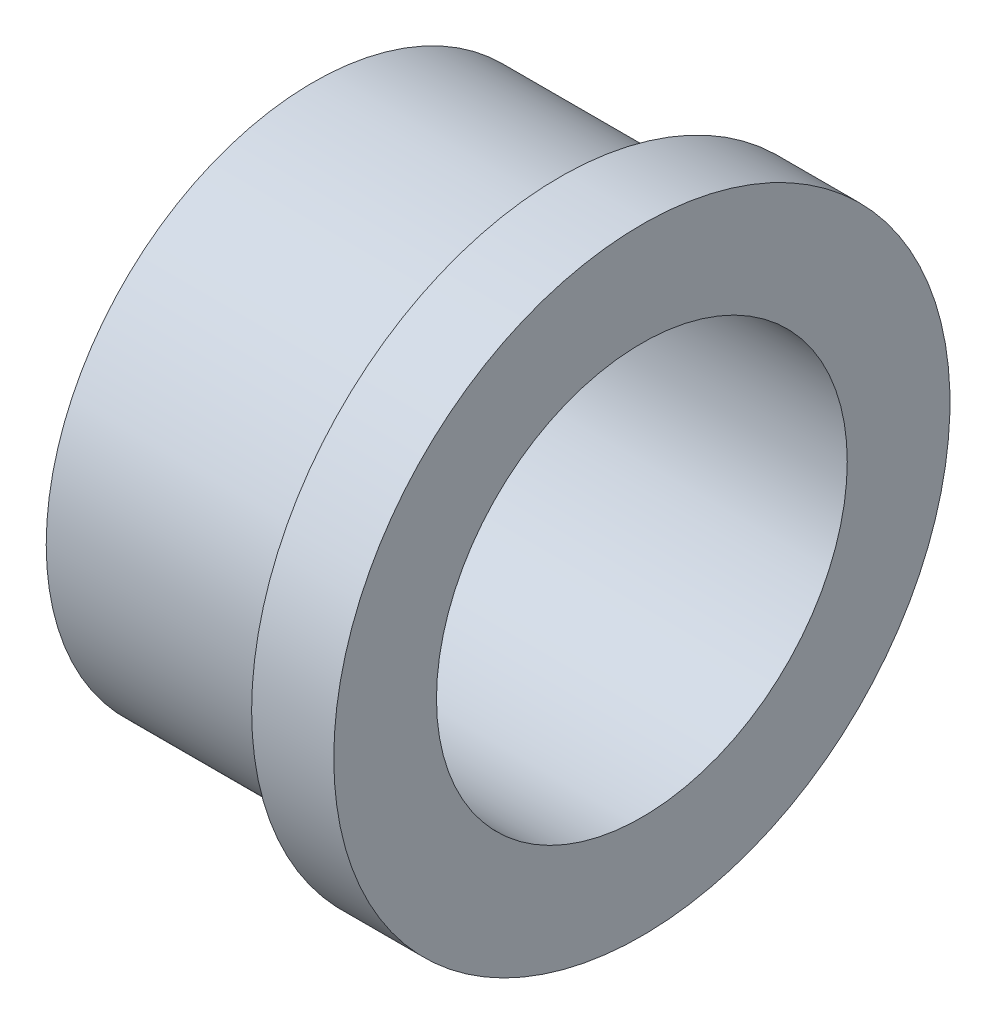
ISO-10303-21;
HEADER;
FILE_DESCRIPTION(('STEP AP214'),'2;1');
FILE_NAME('part.step','',(''),(''),'','','');
FILE_SCHEMA(('AUTOMOTIVE_DESIGN { 1 0 10303 214 1 1 1 1 }'));
ENDSEC;
DATA;
#1=APPLICATION_CONTEXT('core data for automotive mechanical design processes');
#2=APPLICATION_PROTOCOL_DEFINITION('international standard','automotive_design',2000,#1);
#3=PRODUCT_CONTEXT('',#1,'mechanical');
#4=PRODUCT('Part','Part','',(#3));
#5=PRODUCT_RELATED_PRODUCT_CATEGORY('part','',(#4));
#6=PRODUCT_DEFINITION_FORMATION('','',#4);
#7=PRODUCT_DEFINITION_CONTEXT('part definition',#1,'design');
#8=PRODUCT_DEFINITION('design','',#6,#7);
#9=PRODUCT_DEFINITION_SHAPE('','',#8);
#10=(LENGTH_UNIT() NAMED_UNIT(*) SI_UNIT(.MILLI.,.METRE.));
#11=(NAMED_UNIT(*) PLANE_ANGLE_UNIT() SI_UNIT($,.RADIAN.));
#12=(NAMED_UNIT(*) SI_UNIT($,.STERADIAN.) SOLID_ANGLE_UNIT());
#13=UNCERTAINTY_MEASURE_WITH_UNIT(LENGTH_MEASURE(1.E-05),#10,'distance_accuracy_value','');
#14=(GEOMETRIC_REPRESENTATION_CONTEXT(3) GLOBAL_UNCERTAINTY_ASSIGNED_CONTEXT((#13)) GLOBAL_UNIT_ASSIGNED_CONTEXT((#10,
#11,#12)) REPRESENTATION_CONTEXT('',''));
#15=CARTESIAN_POINT('',(0.,0.,0.));
#16=DIRECTION('',(0.,0.,1.));
#17=DIRECTION('',(1.,0.,0.));
#18=AXIS2_PLACEMENT_3D('',#15,#16,#17);
#19=CARTESIAN_POINT('',(-5.,0.,0.));
#20=DIRECTION('',(-1.,0.,0.));
#21=DIRECTION('',(0.,0.,1.));
#22=AXIS2_PLACEMENT_3D('',#19,#20,#21);
#23=CYLINDRICAL_SURFACE('',#22,10.);
#24=CARTESIAN_POINT('',(16.,0.,0.));
#25=DIRECTION('',(-1.,0.,0.));
#26=DIRECTION('',(0.,0.,1.));
#27=AXIS2_PLACEMENT_3D('',#24,#25,#26);
#28=CIRCLE('',#27,10.);
#29=CARTESIAN_POINT('',(16.,0.,10.));
#30=VERTEX_POINT('',#29);
#31=EDGE_CURVE('E59',#30,#30,#28,.T.);
#32=ORIENTED_EDGE('',*,*,#31,.F.);
#33=EDGE_LOOP('',(#32));
#34=FACE_BOUND('',#33,.T.);
#35=CARTESIAN_POINT('',(0.,0.,0.));
#36=DIRECTION('',(-1.,0.,0.));
#37=DIRECTION('',(0.,0.,1.));
#38=AXIS2_PLACEMENT_3D('',#35,#36,#37);
#39=CIRCLE('',#38,10.);
#40=CARTESIAN_POINT('',(0.,0.,10.));
#41=VERTEX_POINT('',#40);
#42=EDGE_CURVE('E10',#41,#41,#39,.T.);
#43=ORIENTED_EDGE('',*,*,#42,.T.);
#44=EDGE_LOOP('',(#43));
#45=FACE_BOUND('',#44,.T.);
#46=ADVANCED_FACE('F37',(#34,#45),#23,.F.);
#47=CARTESIAN_POINT('',(0.,10.,0.));
#48=DIRECTION('',(1.,0.,0.));
#49=DIRECTION('',(0.,0.,-1.));
#50=AXIS2_PLACEMENT_3D('',#47,#48,#49);
#51=PLANE('',#50);
#52=ORIENTED_EDGE('',*,*,#42,.F.);
#53=EDGE_LOOP('',(#52));
#54=FACE_BOUND('',#53,.T.);
#55=CARTESIAN_POINT('',(0.,0.,0.));
#56=DIRECTION('',(-1.,0.,0.));
#57=DIRECTION('',(0.,0.,1.));
#58=AXIS2_PLACEMENT_3D('',#55,#56,#57);
#59=CIRCLE('',#58,13.);
#60=CARTESIAN_POINT('',(0.,0.,13.));
#61=VERTEX_POINT('',#60);
#62=EDGE_CURVE('E43',#61,#61,#59,.T.);
#63=ORIENTED_EDGE('',*,*,#62,.T.);
#64=EDGE_LOOP('',(#63));
#65=FACE_BOUND('',#64,.T.);
#66=ADVANCED_FACE('F66',(#54,#65),#51,.F.);
#67=CARTESIAN_POINT('',(-5.,0.,0.));
#68=DIRECTION('',(-1.,0.,0.));
#69=DIRECTION('',(0.,0.,1.));
#70=AXIS2_PLACEMENT_3D('',#67,#68,#69);
#71=CYLINDRICAL_SURFACE('',#70,13.);
#72=ORIENTED_EDGE('',*,*,#62,.F.);
#73=EDGE_LOOP('',(#72));
#74=FACE_BOUND('',#73,.T.);
#75=CARTESIAN_POINT('',(12.,0.,0.));
#76=DIRECTION('',(-1.,0.,0.));
#77=DIRECTION('',(0.,0.,1.));
#78=AXIS2_PLACEMENT_3D('',#75,#76,#77);
#79=CIRCLE('',#78,13.);
#80=CARTESIAN_POINT('',(12.,0.,13.));
#81=VERTEX_POINT('',#80);
#82=EDGE_CURVE('E47',#81,#81,#79,.T.);
#83=ORIENTED_EDGE('',*,*,#82,.T.);
#84=EDGE_LOOP('',(#83));
#85=FACE_BOUND('',#84,.T.);
#86=ADVANCED_FACE('F70',(#74,#85),#71,.T.);
#87=CARTESIAN_POINT('',(12.,13.,0.));
#88=DIRECTION('',(1.,0.,0.));
#89=DIRECTION('',(0.,0.,-1.));
#90=AXIS2_PLACEMENT_3D('',#87,#88,#89);
#91=PLANE('',#90);
#92=ORIENTED_EDGE('',*,*,#82,.F.);
#93=EDGE_LOOP('',(#92));
#94=FACE_BOUND('',#93,.T.);
#95=CARTESIAN_POINT('',(12.,0.,0.));
#96=DIRECTION('',(-1.,0.,0.));
#97=DIRECTION('',(0.,0.,1.));
#98=AXIS2_PLACEMENT_3D('',#95,#96,#97);
#99=CIRCLE('',#98,15.);
#100=CARTESIAN_POINT('',(12.,0.,15.));
#101=VERTEX_POINT('',#100);
#102=EDGE_CURVE('E51',#101,#101,#99,.T.);
#103=ORIENTED_EDGE('',*,*,#102,.T.);
#104=EDGE_LOOP('',(#103));
#105=FACE_BOUND('',#104,.T.);
#106=ADVANCED_FACE('F75',(#94,#105),#91,.F.);
#107=CARTESIAN_POINT('',(-5.,0.,0.));
#108=DIRECTION('',(-1.,0.,0.));
#109=DIRECTION('',(0.,0.,1.));
#110=AXIS2_PLACEMENT_3D('',#107,#108,#109);
#111=CYLINDRICAL_SURFACE('',#110,15.);
#112=ORIENTED_EDGE('',*,*,#102,.F.);
#113=EDGE_LOOP('',(#112));
#114=FACE_BOUND('',#113,.T.);
#115=CARTESIAN_POINT('',(16.,0.,0.));
#116=DIRECTION('',(-1.,0.,0.));
#117=DIRECTION('',(0.,0.,1.));
#118=AXIS2_PLACEMENT_3D('',#115,#116,#117);
#119=CIRCLE('',#118,15.);
#120=CARTESIAN_POINT('',(16.,0.,15.));
#121=VERTEX_POINT('',#120);
#122=EDGE_CURVE('E56',#121,#121,#119,.T.);
#123=ORIENTED_EDGE('',*,*,#122,.T.);
#124=EDGE_LOOP('',(#123));
#125=FACE_BOUND('',#124,.T.);
#126=ADVANCED_FACE('F81',(#114,#125),#111,.T.);
#127=CARTESIAN_POINT('',(16.,15.,0.));
#128=DIRECTION('',(-1.,0.,0.));
#129=DIRECTION('',(0.,0.,1.));
#130=AXIS2_PLACEMENT_3D('',#127,#128,#129);
#131=PLANE('',#130);
#132=ORIENTED_EDGE('',*,*,#122,.F.);
#133=EDGE_LOOP('',(#132));
#134=FACE_BOUND('',#133,.T.);
#135=ORIENTED_EDGE('',*,*,#31,.T.);
#136=EDGE_LOOP('',(#135));
#137=FACE_BOUND('',#136,.T.);
#138=ADVANCED_FACE('F63',(#134,#137),#131,.F.);
#139=CLOSED_SHELL('',(#46,#66,#86,#106,#126,#138));
#140=MANIFOLD_SOLID_BREP('B2',#139);
#141=ADVANCED_BREP_SHAPE_REPRESENTATION('',(#18,#140),#14);
#142=SHAPE_DEFINITION_REPRESENTATION(#9,#141);
ENDSEC;
END-ISO-10303-21;
